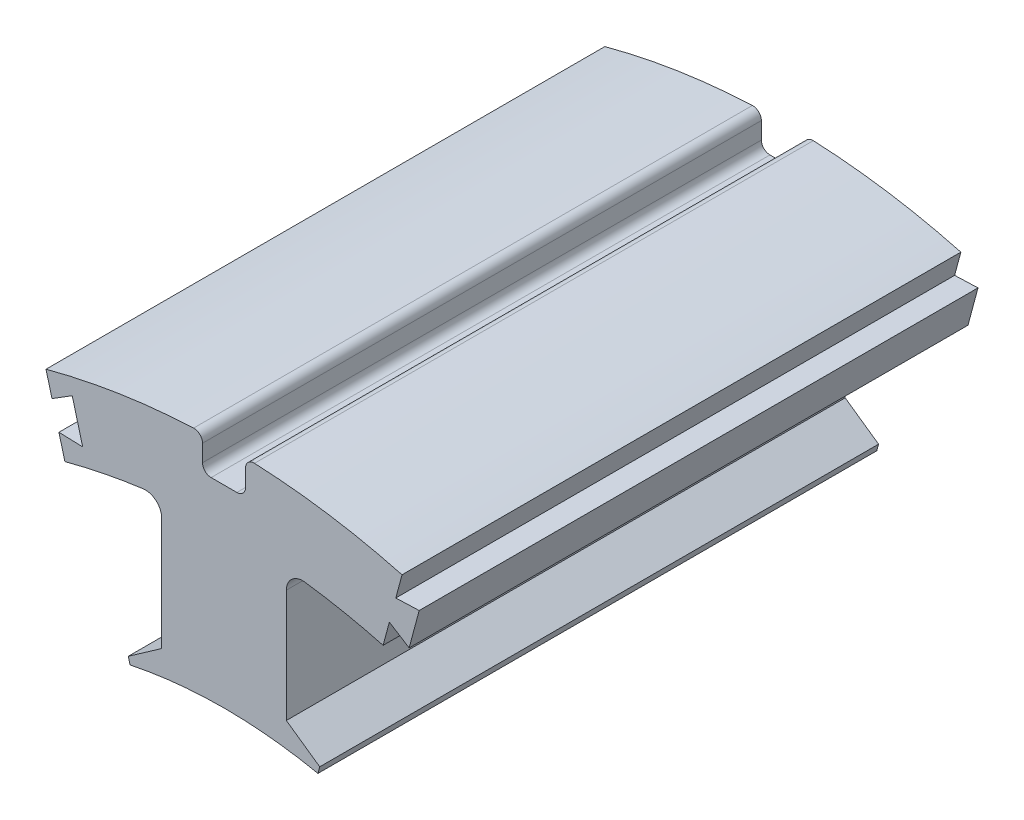
ISO-10303-21;
HEADER;
FILE_DESCRIPTION(('STEP AP214'),'2;1');
FILE_NAME('part.step','',(''),(''),'','','');
FILE_SCHEMA(('AUTOMOTIVE_DESIGN { 1 0 10303 214 1 1 1 1 }'));
ENDSEC;
DATA;
#1=APPLICATION_CONTEXT('core data for automotive mechanical design processes');
#2=APPLICATION_PROTOCOL_DEFINITION('international standard','automotive_design',2000,#1);
#3=PRODUCT_CONTEXT('',#1,'mechanical');
#4=PRODUCT('Part','Part','',(#3));
#5=PRODUCT_RELATED_PRODUCT_CATEGORY('part','',(#4));
#6=PRODUCT_DEFINITION_FORMATION('','',#4);
#7=PRODUCT_DEFINITION_CONTEXT('part definition',#1,'design');
#8=PRODUCT_DEFINITION('design','',#6,#7);
#9=PRODUCT_DEFINITION_SHAPE('','',#8);
#10=(LENGTH_UNIT() NAMED_UNIT(*) SI_UNIT(.MILLI.,.METRE.));
#11=(NAMED_UNIT(*) PLANE_ANGLE_UNIT() SI_UNIT($,.RADIAN.));
#12=(NAMED_UNIT(*) SI_UNIT($,.STERADIAN.) SOLID_ANGLE_UNIT());
#13=UNCERTAINTY_MEASURE_WITH_UNIT(LENGTH_MEASURE(1.E-05),#10,'distance_accuracy_value','');
#14=(GEOMETRIC_REPRESENTATION_CONTEXT(3) GLOBAL_UNCERTAINTY_ASSIGNED_CONTEXT((#13)) GLOBAL_UNIT_ASSIGNED_CONTEXT((#10,
#11,#12)) REPRESENTATION_CONTEXT('',''));
#15=CARTESIAN_POINT('',(0.,0.,0.));
#16=DIRECTION('',(0.,0.,1.));
#17=DIRECTION('',(1.,0.,0.));
#18=AXIS2_PLACEMENT_3D('',#15,#16,#17);
#19=CARTESIAN_POINT('',(22.699292666348,74.669284933281,-33.5));
#20=DIRECTION('',(0.0366913061718422,-0.999326647323789,0.));
#21=DIRECTION('',(0.,0.,-1.));
#22=AXIS2_PLACEMENT_3D('',#19,#20,#21);
#23=PLANE('',#22);
#24=DIRECTION('',(0.,0.,-1.));
#25=VECTOR('',#24,1.);
#26=CARTESIAN_POINT('',(19.980830281915,74.569473789516,32.5));
#27=LINE('',#26,#25);
#28=CARTESIAN_POINT('',(19.980830281915,74.569473789516,32.5));
#29=VERTEX_POINT('',#28);
#30=CARTESIAN_POINT('',(19.980830281915,74.569473789516,-32.5));
#31=VERTEX_POINT('',#30);
#32=EDGE_CURVE('E385',#29,#31,#27,.T.);
#33=ORIENTED_EDGE('',*,*,#32,.F.);
#34=DIRECTION('',(-0.999326647323789,-0.0366913061718422,0.));
#35=VECTOR('',#34,1.);
#36=CARTESIAN_POINT('',(-93.53604338755,70.401584962942,32.5));
#37=LINE('',#36,#35);
#38=CARTESIAN_POINT('',(22.699292666348,74.669284933281,32.5));
#39=VERTEX_POINT('',#38);
#40=EDGE_CURVE('E491',#39,#29,#37,.T.);
#41=ORIENTED_EDGE('',*,*,#40,.F.);
#42=DIRECTION('',(0.,0.,1.));
#43=VECTOR('',#42,1.);
#44=CARTESIAN_POINT('',(22.699292666348,74.669284933281,-32.5));
#45=LINE('',#44,#43);
#46=CARTESIAN_POINT('',(22.699292666348,74.669284933281,-32.5));
#47=VERTEX_POINT('',#46);
#48=EDGE_CURVE('E9',#47,#39,#45,.T.);
#49=ORIENTED_EDGE('',*,*,#48,.F.);
#50=DIRECTION('',(-0.999326647323789,-0.0366913061718422,0.));
#51=VECTOR('',#50,1.);
#52=CARTESIAN_POINT('',(-93.53604338755,70.401584962942,-32.5));
#53=LINE('',#52,#51);
#54=EDGE_CURVE('E482',#47,#31,#53,.T.);
#55=ORIENTED_EDGE('',*,*,#54,.T.);
#56=EDGE_LOOP('',(#33,#41,#49,#55));
#57=FACE_BOUND('',#56,.T.);
#58=ADVANCED_FACE('F15',(#57),#23,.F.);
#59=CARTESIAN_POINT('',(21.534606963387,70.32261871498,-33.5));
#60=DIRECTION('',(-0.965925826288944,0.258819045102985,0.));
#61=DIRECTION('',(0.,0.,1.));
#62=AXIS2_PLACEMENT_3D('',#59,#60,#61);
#63=PLANE('',#62);
#64=ORIENTED_EDGE('',*,*,#48,.T.);
#65=DIRECTION('',(0.258819045102985,0.965925826288944,0.));
#66=VECTOR('',#65,1.);
#67=CARTESIAN_POINT('',(-19.6757227549,-83.47642559036,32.5));
#68=LINE('',#67,#66);
#69=CARTESIAN_POINT('',(21.534606963387,70.32261871498,32.5));
#70=VERTEX_POINT('',#69);
#71=EDGE_CURVE('E536',#70,#39,#68,.T.);
#72=ORIENTED_EDGE('',*,*,#71,.F.);
#73=DIRECTION('',(0.,0.,1.));
#74=VECTOR('',#73,1.);
#75=CARTESIAN_POINT('',(21.534606963387,70.32261871498,-32.5));
#76=LINE('',#75,#74);
#77=CARTESIAN_POINT('',(21.534606963387,70.32261871498,-32.5));
#78=VERTEX_POINT('',#77);
#79=EDGE_CURVE('E25',#78,#70,#76,.T.);
#80=ORIENTED_EDGE('',*,*,#79,.F.);
#81=DIRECTION('',(0.258819045102985,0.965925826288944,0.));
#82=VECTOR('',#81,1.);
#83=CARTESIAN_POINT('',(-19.6757227549,-83.47642559036,-32.5));
#84=LINE('',#83,#82);
#85=EDGE_CURVE('E477',#78,#47,#84,.T.);
#86=ORIENTED_EDGE('',*,*,#85,.T.);
#87=EDGE_LOOP('',(#64,#72,#80,#86));
#88=FACE_BOUND('',#87,.T.);
#89=ADVANCED_FACE('F676',(#88),#63,.F.);
#90=CARTESIAN_POINT('',(19.230255051117,71.768288893278,-33.5));
#91=DIRECTION('',(0.531438926905023,0.847096610175037,0.));
#92=DIRECTION('',(0.,0.,-1.));
#93=AXIS2_PLACEMENT_3D('',#90,#91,#92);
#94=PLANE('',#93);
#95=ORIENTED_EDGE('',*,*,#79,.T.);
#96=DIRECTION('',(0.847096610175037,-0.531438926905023,0.));
#97=VECTOR('',#96,1.);
#98=CARTESIAN_POINT('',(1.745775221627,82.737442926547,32.5));
#99=LINE('',#98,#97);
#100=CARTESIAN_POINT('',(19.230255051117,71.768288893278,32.5));
#101=VERTEX_POINT('',#100);
#102=EDGE_CURVE('E535',#101,#70,#99,.T.);
#103=ORIENTED_EDGE('',*,*,#102,.F.);
#104=DIRECTION('',(0.,0.,1.));
#105=VECTOR('',#104,1.);
#106=CARTESIAN_POINT('',(19.230255051117,71.768288893278,-32.5));
#107=LINE('',#106,#105);
#108=CARTESIAN_POINT('',(19.230255051117,71.768288893278,-32.5));
#109=VERTEX_POINT('',#108);
#110=EDGE_CURVE('E519',#109,#101,#107,.T.);
#111=ORIENTED_EDGE('',*,*,#110,.F.);
#112=DIRECTION('',(0.847096610175037,-0.531438926905023,0.));
#113=VECTOR('',#112,1.);
#114=CARTESIAN_POINT('',(1.745775221627,82.737442926547,-32.5));
#115=LINE('',#114,#113);
#116=EDGE_CURVE('E478',#109,#78,#115,.T.);
#117=ORIENTED_EDGE('',*,*,#116,.T.);
#118=EDGE_LOOP('',(#95,#103,#111,#117));
#119=FACE_BOUND('',#118,.T.);
#120=ADVANCED_FACE('F17',(#119),#94,.F.);
#121=CARTESIAN_POINT('',(-7.25,55.865,-32.5));
#122=DIRECTION('',(0.573632179703012,-0.819113009547017,0.));
#123=DIRECTION('',(0.,0.,-1.));
#124=AXIS2_PLACEMENT_3D('',#121,#122,#123);
#125=PLANE('',#124);
#126=DIRECTION('',(0.,0.,-1.));
#127=VECTOR('',#126,1.);
#128=CARTESIAN_POINT('',(-11.134,53.145,32.5));
#129=LINE('',#128,#127);
#130=CARTESIAN_POINT('',(-11.134,53.145,32.5));
#131=VERTEX_POINT('',#130);
#132=CARTESIAN_POINT('',(-11.134,53.145,-32.5));
#133=VERTEX_POINT('',#132);
#134=EDGE_CURVE('E36',#131,#133,#129,.T.);
#135=ORIENTED_EDGE('',*,*,#134,.F.);
#136=DIRECTION('',(-0.819113009547017,-0.573632179703012,0.));
#137=VECTOR('',#136,1.);
#138=CARTESIAN_POINT('',(-7.25,55.865,32.5));
#139=LINE('',#138,#137);
#140=CARTESIAN_POINT('',(-7.25,55.865,32.5));
#141=VERTEX_POINT('',#140);
#142=EDGE_CURVE('E417',#141,#131,#139,.T.);
#143=ORIENTED_EDGE('',*,*,#142,.F.);
#144=DIRECTION('',(0.,0.,1.));
#145=VECTOR('',#144,1.);
#146=CARTESIAN_POINT('',(-7.25,55.865,-32.5));
#147=LINE('',#146,#145);
#148=CARTESIAN_POINT('',(-7.25,55.865,-32.5));
#149=VERTEX_POINT('',#148);
#150=EDGE_CURVE('E48',#149,#141,#147,.T.);
#151=ORIENTED_EDGE('',*,*,#150,.F.);
#152=DIRECTION('',(-0.819113009547017,-0.573632179703012,0.));
#153=VECTOR('',#152,1.);
#154=CARTESIAN_POINT('',(-7.25,55.865,-32.5));
#155=LINE('',#154,#153);
#156=EDGE_CURVE('E365',#149,#133,#155,.T.);
#157=ORIENTED_EDGE('',*,*,#156,.T.);
#158=EDGE_LOOP('',(#135,#143,#151,#157));
#159=FACE_BOUND('',#158,.T.);
#160=ADVANCED_FACE('F762',(#159),#125,.F.);
#161=CARTESIAN_POINT('',(-7.25,68.996,-32.5));
#162=DIRECTION('',(1.,0.,0.));
#163=DIRECTION('',(0.,1.,0.));
#164=AXIS2_PLACEMENT_3D('',#161,#162,#163);
#165=PLANE('',#164);
#166=ORIENTED_EDGE('',*,*,#150,.T.);
#167=DIRECTION('',(0.,-1.,0.));
#168=VECTOR('',#167,1.);
#169=CARTESIAN_POINT('',(-7.25,68.996,32.5));
#170=LINE('',#169,#168);
#171=CARTESIAN_POINT('',(-7.25,68.996,32.5));
#172=VERTEX_POINT('',#171);
#173=EDGE_CURVE('E413',#172,#141,#170,.T.);
#174=ORIENTED_EDGE('',*,*,#173,.F.);
#175=DIRECTION('',(0.,0.,1.));
#176=VECTOR('',#175,1.);
#177=CARTESIAN_POINT('',(-7.25,68.996,-32.5));
#178=LINE('',#177,#176);
#179=CARTESIAN_POINT('',(-7.25,68.996,-32.5));
#180=VERTEX_POINT('',#179);
#181=EDGE_CURVE('E458',#180,#172,#178,.T.);
#182=ORIENTED_EDGE('',*,*,#181,.F.);
#183=DIRECTION('',(0.,-1.,0.));
#184=VECTOR('',#183,1.);
#185=CARTESIAN_POINT('',(-7.25,68.996,-32.5));
#186=LINE('',#185,#184);
#187=EDGE_CURVE('E370',#180,#149,#186,.T.);
#188=ORIENTED_EDGE('',*,*,#187,.T.);
#189=EDGE_LOOP('',(#166,#174,#182,#188));
#190=FACE_BOUND('',#189,.T.);
#191=ADVANCED_FACE('F759',(#190),#165,.F.);
#192=CARTESIAN_POINT('',(-9.149889236462,68.996050217928,-32.5));
#193=DIRECTION('',(0.,0.,-1.));
#194=DIRECTION('',(-0.131526111426021,0.991312706472156,0.));
#195=AXIS2_PLACEMENT_3D('',#192,#193,#194);
#196=CYLINDRICAL_SURFACE('',#195,1.899889237125);
#197=ORIENTED_EDGE('',*,*,#181,.T.);
#198=CARTESIAN_POINT('',(-9.149889236462,68.996050217928,32.5));
#199=DIRECTION('',(0.,0.,-1.));
#200=DIRECTION('',(-0.131526111426021,0.991312706472156,0.));
#201=AXIS2_PLACEMENT_3D('',#198,#199,#200);
#202=CIRCLE('',#201,1.899889237125);
#203=CARTESIAN_POINT('',(-9.399774279961,70.87943455958,32.5));
#204=VERTEX_POINT('',#203);
#205=EDGE_CURVE('E362',#204,#172,#202,.T.);
#206=ORIENTED_EDGE('',*,*,#205,.F.);
#207=DIRECTION('',(0.,0.,1.));
#208=VECTOR('',#207,1.);
#209=CARTESIAN_POINT('',(-9.399774279961,70.87943455958,-32.5));
#210=LINE('',#209,#208);
#211=CARTESIAN_POINT('',(-9.399774279961,70.87943455958,-32.5));
#212=VERTEX_POINT('',#211);
#213=EDGE_CURVE('E454',#212,#204,#210,.T.);
#214=ORIENTED_EDGE('',*,*,#213,.F.);
#215=CARTESIAN_POINT('',(-9.149889236462,68.996050217928,-32.5));
#216=DIRECTION('',(0.,0.,-1.));
#217=DIRECTION('',(-0.131526111426021,0.991312706472156,0.));
#218=AXIS2_PLACEMENT_3D('',#215,#216,#217);
#219=CIRCLE('',#218,1.899889237125);
#220=EDGE_CURVE('E352',#212,#180,#219,.T.);
#221=ORIENTED_EDGE('',*,*,#220,.T.);
#222=EDGE_LOOP('',(#197,#206,#214,#221));
#223=FACE_BOUND('',#222,.T.);
#224=ADVANCED_FACE('F763',(#223),#196,.F.);
#225=CARTESIAN_POINT('',(4.263256414561E-13,-2.28084218179E-12,-32.5));
#226=DIRECTION('',(0.,0.,-1.));
#227=DIRECTION('',(-0.258819045102985,0.965925826288944,0.));
#228=AXIS2_PLACEMENT_3D('',#225,#226,#227);
#229=CYLINDRICAL_SURFACE('',#228,71.500000000002);
#230=ORIENTED_EDGE('',*,*,#213,.T.);
#231=CARTESIAN_POINT('',(4.263256414561E-13,-2.28084218179E-12,32.5));
#232=DIRECTION('',(0.,0.,-1.));
#233=DIRECTION('',(-0.258819045102985,0.965925826288944,0.));
#234=AXIS2_PLACEMENT_3D('',#231,#232,#233);
#235=CIRCLE('',#234,71.500000000002);
#236=CARTESIAN_POINT('',(-18.50556172483,69.063696579668,32.5));
#237=VERTEX_POINT('',#236);
#238=EDGE_CURVE('E358',#237,#204,#235,.T.);
#239=ORIENTED_EDGE('',*,*,#238,.F.);
#240=DIRECTION('',(0.,0.,1.));
#241=VECTOR('',#240,1.);
#242=CARTESIAN_POINT('',(-18.50556172483,69.063696579668,-32.5));
#243=LINE('',#242,#241);
#244=CARTESIAN_POINT('',(-18.50556172483,69.063696579668,-32.5));
#245=VERTEX_POINT('',#244);
#246=EDGE_CURVE('E457',#245,#237,#243,.T.);
#247=ORIENTED_EDGE('',*,*,#246,.F.);
#248=CARTESIAN_POINT('',(4.263256414561E-13,-2.28084218179E-12,-32.5));
#249=DIRECTION('',(0.,0.,-1.));
#250=DIRECTION('',(-0.258819045102985,0.965925826288944,0.));
#251=AXIS2_PLACEMENT_3D('',#248,#249,#250);
#252=CIRCLE('',#251,71.500000000002);
#253=EDGE_CURVE('E348',#245,#212,#252,.T.);
#254=ORIENTED_EDGE('',*,*,#253,.T.);
#255=EDGE_LOOP('',(#230,#239,#247,#254));
#256=FACE_BOUND('',#255,.T.);
#257=ADVANCED_FACE('F772',(#256),#229,.F.);
#258=CARTESIAN_POINT('',(-20.7055236082,77.274066103125,-32.5));
#259=DIRECTION('',(0.965925826288944,0.258819045102985,0.));
#260=DIRECTION('',(0.,0.,-1.));
#261=AXIS2_PLACEMENT_3D('',#258,#259,#260);
#262=PLANE('',#261);
#263=ORIENTED_EDGE('',*,*,#246,.T.);
#264=DIRECTION('',(0.258819045102985,-0.965925826288944,0.));
#265=VECTOR('',#264,1.);
#266=CARTESIAN_POINT('',(-20.7055236082,77.274066103125,32.5));
#267=LINE('',#266,#265);
#268=CARTESIAN_POINT('',(-19.2043731466,71.671696310649,32.5));
#269=VERTEX_POINT('',#268);
#270=EDGE_CURVE('E361',#269,#237,#267,.T.);
#271=ORIENTED_EDGE('',*,*,#270,.F.);
#272=DIRECTION('',(0.,0.,1.));
#273=VECTOR('',#272,1.);
#274=CARTESIAN_POINT('',(-19.2043731466,71.671696310649,-32.5));
#275=LINE('',#274,#273);
#276=CARTESIAN_POINT('',(-19.2043731466,71.671696310649,-32.5));
#277=VERTEX_POINT('',#276);
#278=EDGE_CURVE('E337',#277,#269,#275,.T.);
#279=ORIENTED_EDGE('',*,*,#278,.F.);
#280=DIRECTION('',(0.258819045102985,-0.965925826288944,0.));
#281=VECTOR('',#280,1.);
#282=CARTESIAN_POINT('',(-20.7055236082,77.274066103125,-32.5));
#283=LINE('',#282,#281);
#284=EDGE_CURVE('E355',#277,#245,#283,.T.);
#285=ORIENTED_EDGE('',*,*,#284,.T.);
#286=EDGE_LOOP('',(#263,#271,#279,#285));
#287=FACE_BOUND('',#286,.T.);
#288=ADVANCED_FACE('F955',(#287),#262,.F.);
#289=CARTESIAN_POINT('',(-19.2043731466,71.671696310649,-34.5));
#290=DIRECTION('',(0.0313823553107431,0.999507452586098,0.));
#291=DIRECTION('',(0.,0.,-1.));
#292=AXIS2_PLACEMENT_3D('',#289,#290,#291);
#293=PLANE('',#292);
#294=DIRECTION('',(0.,0.,1.));
#295=VECTOR('',#294,1.);
#296=CARTESIAN_POINT('',(-16.43761447085,71.584826119139,-32.5));
#297=LINE('',#296,#295);
#298=CARTESIAN_POINT('',(-16.43761447085,71.584826119139,-32.5));
#299=VERTEX_POINT('',#298);
#300=CARTESIAN_POINT('',(-16.43761447085,71.584826119139,32.5));
#301=VERTEX_POINT('',#300);
#302=EDGE_CURVE('E331',#299,#301,#297,.T.);
#303=ORIENTED_EDGE('',*,*,#302,.F.);
#304=DIRECTION('',(-0.999507452586098,0.0313823553107431,0.));
#305=VECTOR('',#304,1.);
#306=CARTESIAN_POINT('',(-9.555933026172,71.368756322287,-32.5));
#307=LINE('',#306,#305);
#308=EDGE_CURVE('E387',#299,#277,#307,.T.);
#309=ORIENTED_EDGE('',*,*,#308,.T.);
#310=ORIENTED_EDGE('',*,*,#278,.T.);
#311=DIRECTION('',(-0.999507452586098,0.0313823553107431,0.));
#312=VECTOR('',#311,1.);
#313=CARTESIAN_POINT('',(-9.555933026172,71.368756322287,32.5));
#314=LINE('',#313,#312);
#315=EDGE_CURVE('E396',#301,#269,#314,.T.);
#316=ORIENTED_EDGE('',*,*,#315,.F.);
#317=EDGE_LOOP('',(#303,#309,#310,#316));
#318=FACE_BOUND('',#317,.T.);
#319=ADVANCED_FACE('F742',(#318),#293,.T.);
#320=CARTESIAN_POINT('',(-16.43761447085,71.584826119139,-34.5));
#321=DIRECTION('',(-0.965925826288944,-0.258819045102985,0.));
#322=DIRECTION('',(-0.258819045102985,0.965925826288944,0.));
#323=AXIS2_PLACEMENT_3D('',#320,#321,#322);
#324=PLANE('',#323);
#325=DIRECTION('',(0.,0.,1.));
#326=VECTOR('',#325,1.);
#327=CARTESIAN_POINT('',(-17.65406398284,76.124677502698,-32.5));
#328=LINE('',#327,#326);
#329=CARTESIAN_POINT('',(-17.65406398284,76.124677502698,-32.5));
#330=VERTEX_POINT('',#329);
#331=CARTESIAN_POINT('',(-17.65406398284,76.124677502698,32.5));
#332=VERTEX_POINT('',#331);
#333=EDGE_CURVE('E19',#330,#332,#328,.T.);
#334=ORIENTED_EDGE('',*,*,#333,.F.);
#335=DIRECTION('',(0.258819045102985,-0.965925826288944,0.));
#336=VECTOR('',#335,1.);
#337=CARTESIAN_POINT('',(-15.45389626549,67.913539796407,-32.5));
#338=LINE('',#337,#336);
#339=EDGE_CURVE('E415',#330,#299,#338,.T.);
#340=ORIENTED_EDGE('',*,*,#339,.T.);
#341=ORIENTED_EDGE('',*,*,#302,.T.);
#342=DIRECTION('',(0.258819045102985,-0.965925826288944,0.));
#343=VECTOR('',#342,1.);
#344=CARTESIAN_POINT('',(-15.45389626549,67.913539796407,32.5));
#345=LINE('',#344,#343);
#346=EDGE_CURVE('E392',#332,#301,#345,.T.);
#347=ORIENTED_EDGE('',*,*,#346,.F.);
#348=EDGE_LOOP('',(#334,#340,#341,#347));
#349=FACE_BOUND('',#348,.T.);
#350=ADVANCED_FACE('F739',(#349),#324,.T.);
#351=CARTESIAN_POINT('',(-17.65406398284,76.124677502698,-34.5));
#352=DIRECTION('',(0.526931643222955,-0.849907667555927,0.));
#353=DIRECTION('',(0.,0.,-1.));
#354=AXIS2_PLACEMENT_3D('',#351,#352,#353);
#355=PLANE('',#354);
#356=DIRECTION('',(0.,0.,1.));
#357=VECTOR('',#356,1.);
#358=CARTESIAN_POINT('',(-20.00671218642,74.666066372145,-32.5));
#359=LINE('',#358,#357);
#360=CARTESIAN_POINT('',(-20.00671218642,74.666066372145,-32.5));
#361=VERTEX_POINT('',#360);
#362=CARTESIAN_POINT('',(-20.00671218642,74.666066372145,32.5));
#363=VERTEX_POINT('',#362);
#364=EDGE_CURVE('E550',#361,#363,#359,.T.);
#365=ORIENTED_EDGE('',*,*,#364,.F.);
#366=DIRECTION('',(0.849907667555927,0.526931643222955,0.));
#367=VECTOR('',#366,1.);
#368=CARTESIAN_POINT('',(-13.07044533865,78.966461141423,-32.5));
#369=LINE('',#368,#367);
#370=EDGE_CURVE('E323',#361,#330,#369,.T.);
#371=ORIENTED_EDGE('',*,*,#370,.T.);
#372=ORIENTED_EDGE('',*,*,#333,.T.);
#373=DIRECTION('',(0.849907667555927,0.526931643222955,0.));
#374=VECTOR('',#373,1.);
#375=CARTESIAN_POINT('',(-13.07044533865,78.966461141423,32.5));
#376=LINE('',#375,#374);
#377=EDGE_CURVE('E400',#363,#332,#376,.T.);
#378=ORIENTED_EDGE('',*,*,#377,.F.);
#379=EDGE_LOOP('',(#365,#371,#372,#378));
#380=FACE_BOUND('',#379,.T.);
#381=ADVANCED_FACE('F743',(#380),#355,.T.);
#382=CARTESIAN_POINT('',(-20.7055236082,77.274066103125,-32.5));
#383=DIRECTION('',(0.965925826288944,0.258819045102985,0.));
#384=DIRECTION('',(0.,0.,-1.));
#385=AXIS2_PLACEMENT_3D('',#382,#383,#384);
#386=PLANE('',#385);
#387=ORIENTED_EDGE('',*,*,#364,.T.);
#388=DIRECTION('',(0.258819045102985,-0.965925826288944,0.));
#389=VECTOR('',#388,1.);
#390=CARTESIAN_POINT('',(-20.7055236082,77.274066103125,32.5));
#391=LINE('',#390,#389);
#392=CARTESIAN_POINT('',(-20.7055236082,77.274066103126,32.5));
#393=VERTEX_POINT('',#392);
#394=EDGE_CURVE('E556',#393,#363,#391,.T.);
#395=ORIENTED_EDGE('',*,*,#394,.F.);
#396=DIRECTION('',(0.,0.,1.));
#397=VECTOR('',#396,1.);
#398=CARTESIAN_POINT('',(-20.7055236082,77.274066103126,-32.5));
#399=LINE('',#398,#397);
#400=CARTESIAN_POINT('',(-20.7055236082,77.274066103126,-32.5));
#401=VERTEX_POINT('',#400);
#402=EDGE_CURVE('E299',#401,#393,#399,.T.);
#403=ORIENTED_EDGE('',*,*,#402,.F.);
#404=DIRECTION('',(0.258819045102985,-0.965925826288944,0.));
#405=VECTOR('',#404,1.);
#406=CARTESIAN_POINT('',(-20.7055236082,77.274066103125,-32.5));
#407=LINE('',#406,#405);
#408=EDGE_CURVE('E316',#401,#361,#407,.T.);
#409=ORIENTED_EDGE('',*,*,#408,.T.);
#410=EDGE_LOOP('',(#387,#395,#403,#409));
#411=FACE_BOUND('',#410,.T.);
#412=ADVANCED_FACE('F608',(#411),#386,.F.);
#413=CARTESIAN_POINT('',(1.501021529293E-13,-5.826450433233E-13,-32.5));
#414=DIRECTION('',(0.,0.,-1.));
#415=DIRECTION('',(-0.0443040385324079,0.999018094015178,0.));
#416=AXIS2_PLACEMENT_3D('',#413,#414,#415);
#417=CYLINDRICAL_SURFACE('',#416,80.000000000001);
#418=DIRECTION('',(0.,0.,1.));
#419=VECTOR('',#418,1.);
#420=CARTESIAN_POINT('',(-3.544323082591,79.921447521214,-32.5));
#421=LINE('',#420,#419);
#422=CARTESIAN_POINT('',(-3.544323082591,79.921447521214,-32.5));
#423=VERTEX_POINT('',#422);
#424=CARTESIAN_POINT('',(-3.544323082591,79.921447521214,32.5));
#425=VERTEX_POINT('',#424);
#426=EDGE_CURVE('E288',#423,#425,#421,.T.);
#427=ORIENTED_EDGE('',*,*,#426,.F.);
#428=CARTESIAN_POINT('',(1.501021529293E-13,-5.826450433233E-13,-32.5));
#429=DIRECTION('',(0.,0.,1.));
#430=DIRECTION('',(-0.0443040385324079,0.999018094015178,0.));
#431=AXIS2_PLACEMENT_3D('',#428,#429,#430);
#432=CIRCLE('',#431,80.000000000001);
#433=EDGE_CURVE('E291',#423,#401,#432,.T.);
#434=ORIENTED_EDGE('',*,*,#433,.T.);
#435=ORIENTED_EDGE('',*,*,#402,.T.);
#436=CARTESIAN_POINT('',(1.501021529293E-13,-5.826450433233E-13,32.5));
#437=DIRECTION('',(0.,0.,1.));
#438=DIRECTION('',(-0.0443040385324079,0.999018094015178,0.));
#439=AXIS2_PLACEMENT_3D('',#436,#437,#438);
#440=CIRCLE('',#439,80.000000000001);
#441=EDGE_CURVE('E294',#425,#393,#440,.T.);
#442=ORIENTED_EDGE('',*,*,#441,.F.);
#443=EDGE_LOOP('',(#427,#434,#435,#442));
#444=FACE_BOUND('',#443,.T.);
#445=ADVANCED_FACE('F289',(#444),#417,.T.);
#446=CARTESIAN_POINT('',(-3.500696482201,78.921702424813,-32.5));
#447=DIRECTION('',(0.,0.,-1.));
#448=DIRECTION('',(0.999999955786117,0.000297368062342735,0.));
#449=AXIS2_PLACEMENT_3D('',#446,#447,#448);
#450=CYLINDRICAL_SURFACE('',#449,1.000696526446);
#451=DIRECTION('',(0.,0.,1.));
#452=VECTOR('',#451,1.);
#453=CARTESIAN_POINT('',(-2.5,78.922,-32.5));
#454=LINE('',#453,#452);
#455=CARTESIAN_POINT('',(-2.5,78.922,-32.5));
#456=VERTEX_POINT('',#455);
#457=CARTESIAN_POINT('',(-2.5,78.922,32.5));
#458=VERTEX_POINT('',#457);
#459=EDGE_CURVE('E301',#456,#458,#454,.T.);
#460=ORIENTED_EDGE('',*,*,#459,.F.);
#461=CARTESIAN_POINT('',(-3.500696482201,78.921702424813,-32.5));
#462=DIRECTION('',(0.,0.,1.));
#463=DIRECTION('',(0.999999955786117,0.000297368062342735,0.));
#464=AXIS2_PLACEMENT_3D('',#461,#462,#463);
#465=CIRCLE('',#464,1.000696526446);
#466=EDGE_CURVE('E302',#456,#423,#465,.T.);
#467=ORIENTED_EDGE('',*,*,#466,.T.);
#468=ORIENTED_EDGE('',*,*,#426,.T.);
#469=CARTESIAN_POINT('',(-3.500696482201,78.921702424813,32.5));
#470=DIRECTION('',(0.,0.,1.));
#471=DIRECTION('',(0.999999955786117,0.000297368062342735,0.));
#472=AXIS2_PLACEMENT_3D('',#469,#470,#471);
#473=CIRCLE('',#472,1.000696526446);
#474=EDGE_CURVE('E468',#458,#425,#473,.T.);
#475=ORIENTED_EDGE('',*,*,#474,.F.);
#476=EDGE_LOOP('',(#460,#467,#468,#475));
#477=FACE_BOUND('',#476,.T.);
#478=ADVANCED_FACE('F304',(#477),#450,.T.);
#479=CARTESIAN_POINT('',(-2.5,76.961,-32.5));
#480=DIRECTION('',(-1.,0.,0.));
#481=DIRECTION('',(0.,0.,1.));
#482=AXIS2_PLACEMENT_3D('',#479,#480,#481);
#483=PLANE('',#482);
#484=ORIENTED_EDGE('',*,*,#459,.T.);
#485=DIRECTION('',(0.,1.,0.));
#486=VECTOR('',#485,1.);
#487=CARTESIAN_POINT('',(-2.5,76.961,32.5));
#488=LINE('',#487,#486);
#489=CARTESIAN_POINT('',(-2.5,76.961,32.5));
#490=VERTEX_POINT('',#489);
#491=EDGE_CURVE('E463',#490,#458,#488,.T.);
#492=ORIENTED_EDGE('',*,*,#491,.F.);
#493=DIRECTION('',(0.,0.,1.));
#494=VECTOR('',#493,1.);
#495=CARTESIAN_POINT('',(-2.5,76.961,-32.5));
#496=LINE('',#495,#494);
#497=CARTESIAN_POINT('',(-2.5,76.961,-32.5));
#498=VERTEX_POINT('',#497);
#499=EDGE_CURVE('E450',#498,#490,#496,.T.);
#500=ORIENTED_EDGE('',*,*,#499,.F.);
#501=DIRECTION('',(0.,1.,0.));
#502=VECTOR('',#501,1.);
#503=CARTESIAN_POINT('',(-2.5,76.961,-32.5));
#504=LINE('',#503,#502);
#505=EDGE_CURVE('E309',#498,#456,#504,.T.);
#506=ORIENTED_EDGE('',*,*,#505,.T.);
#507=EDGE_LOOP('',(#484,#492,#500,#506));
#508=FACE_BOUND('',#507,.T.);
#509=ADVANCED_FACE('F711',(#508),#483,.F.);
#510=CARTESIAN_POINT('',(-1.5,76.961,-32.5));
#511=DIRECTION('',(0.,0.,-1.));
#512=DIRECTION('',(0.,-1.,0.));
#513=AXIS2_PLACEMENT_3D('',#510,#511,#512);
#514=CYLINDRICAL_SURFACE('',#513,1.);
#515=ORIENTED_EDGE('',*,*,#499,.T.);
#516=CARTESIAN_POINT('',(-1.5,76.961,32.5));
#517=DIRECTION('',(0.,0.,-1.));
#518=DIRECTION('',(0.,-1.,0.));
#519=AXIS2_PLACEMENT_3D('',#516,#517,#518);
#520=CIRCLE('',#519,1.);
#521=CARTESIAN_POINT('',(-1.5,75.961,32.5));
#522=VERTEX_POINT('',#521);
#523=EDGE_CURVE('E467',#522,#490,#520,.T.);
#524=ORIENTED_EDGE('',*,*,#523,.F.);
#525=DIRECTION('',(0.,0.,1.));
#526=VECTOR('',#525,1.);
#527=CARTESIAN_POINT('',(-1.5,75.961,-32.5));
#528=LINE('',#527,#526);
#529=CARTESIAN_POINT('',(-1.5,75.961,-32.5));
#530=VERTEX_POINT('',#529);
#531=EDGE_CURVE('E570',#530,#522,#528,.T.);
#532=ORIENTED_EDGE('',*,*,#531,.F.);
#533=CARTESIAN_POINT('',(-1.5,76.961,-32.5));
#534=DIRECTION('',(0.,0.,-1.));
#535=DIRECTION('',(0.,-1.,0.));
#536=AXIS2_PLACEMENT_3D('',#533,#534,#535);
#537=CIRCLE('',#536,1.);
#538=EDGE_CURVE('E433',#530,#498,#537,.T.);
#539=ORIENTED_EDGE('',*,*,#538,.T.);
#540=EDGE_LOOP('',(#515,#524,#532,#539));
#541=FACE_BOUND('',#540,.T.);
#542=ADVANCED_FACE('F708',(#541),#514,.F.);
#543=CARTESIAN_POINT('',(1.5,75.961,-32.5));
#544=DIRECTION('',(0.,-1.,0.));
#545=DIRECTION('',(0.,0.,-1.));
#546=AXIS2_PLACEMENT_3D('',#543,#544,#545);
#547=PLANE('',#546);
#548=DIRECTION('',(1.,0.,0.));
#549=VECTOR('',#548,1.);
#550=CARTESIAN_POINT('',(-1.5,75.961,-32.5));
#551=LINE('',#550,#549);
#552=CARTESIAN_POINT('',(1.5,75.961,-32.5));
#553=VERTEX_POINT('',#552);
#554=EDGE_CURVE('E436',#530,#553,#551,.T.);
#555=ORIENTED_EDGE('',*,*,#554,.F.);
#556=ORIENTED_EDGE('',*,*,#531,.T.);
#557=DIRECTION('',(-1.,0.,0.));
#558=VECTOR('',#557,1.);
#559=CARTESIAN_POINT('',(1.5,75.961,32.5));
#560=LINE('',#559,#558);
#561=CARTESIAN_POINT('',(1.5,75.961,32.5));
#562=VERTEX_POINT('',#561);
#563=EDGE_CURVE('E546',#562,#522,#560,.T.);
#564=ORIENTED_EDGE('',*,*,#563,.F.);
#565=DIRECTION('',(0.,0.,1.));
#566=VECTOR('',#565,1.);
#567=CARTESIAN_POINT('',(1.5,75.961,-32.5));
#568=LINE('',#567,#566);
#569=EDGE_CURVE('E567',#553,#562,#568,.T.);
#570=ORIENTED_EDGE('',*,*,#569,.F.);
#571=EDGE_LOOP('',(#555,#556,#564,#570));
#572=FACE_BOUND('',#571,.T.);
#573=ADVANCED_FACE('F704',(#572),#547,.F.);
#574=CARTESIAN_POINT('',(1.5,76.961,-32.5));
#575=DIRECTION('',(0.,0.,-1.));
#576=DIRECTION('',(1.,0.,0.));
#577=AXIS2_PLACEMENT_3D('',#574,#575,#576);
#578=CYLINDRICAL_SURFACE('',#577,1.);
#579=ORIENTED_EDGE('',*,*,#569,.T.);
#580=CARTESIAN_POINT('',(1.5,76.961,32.5));
#581=DIRECTION('',(0.,0.,-1.));
#582=DIRECTION('',(1.,0.,0.));
#583=AXIS2_PLACEMENT_3D('',#580,#581,#582);
#584=CIRCLE('',#583,1.);
#585=CARTESIAN_POINT('',(2.5,76.961,32.5));
#586=VERTEX_POINT('',#585);
#587=EDGE_CURVE('E422',#586,#562,#584,.T.);
#588=ORIENTED_EDGE('',*,*,#587,.F.);
#589=DIRECTION('',(0.,0.,1.));
#590=VECTOR('',#589,1.);
#591=CARTESIAN_POINT('',(2.5,76.961,-32.5));
#592=LINE('',#591,#590);
#593=CARTESIAN_POINT('',(2.5,76.961,-32.5));
#594=VERTEX_POINT('',#593);
#595=EDGE_CURVE('E600',#594,#586,#592,.T.);
#596=ORIENTED_EDGE('',*,*,#595,.F.);
#597=CARTESIAN_POINT('',(1.5,76.961,-32.5));
#598=DIRECTION('',(0.,0.,-1.));
#599=DIRECTION('',(1.,0.,0.));
#600=AXIS2_PLACEMENT_3D('',#597,#598,#599);
#601=CIRCLE('',#600,1.);
#602=EDGE_CURVE('E444',#594,#553,#601,.T.);
#603=ORIENTED_EDGE('',*,*,#602,.T.);
#604=EDGE_LOOP('',(#579,#588,#596,#603));
#605=FACE_BOUND('',#604,.T.);
#606=ADVANCED_FACE('F697',(#605),#578,.F.);
#607=CARTESIAN_POINT('',(2.5,78.922,-32.5));
#608=DIRECTION('',(1.,0.,0.));
#609=DIRECTION('',(0.,1.,0.));
#610=AXIS2_PLACEMENT_3D('',#607,#608,#609);
#611=PLANE('',#610);
#612=ORIENTED_EDGE('',*,*,#595,.T.);
#613=DIRECTION('',(0.,-1.,0.));
#614=VECTOR('',#613,1.);
#615=CARTESIAN_POINT('',(2.5,78.922,32.5));
#616=LINE('',#615,#614);
#617=CARTESIAN_POINT('',(2.5,78.922,32.5));
#618=VERTEX_POINT('',#617);
#619=EDGE_CURVE('E423',#618,#586,#616,.T.);
#620=ORIENTED_EDGE('',*,*,#619,.F.);
#621=DIRECTION('',(0.,0.,1.));
#622=VECTOR('',#621,1.);
#623=CARTESIAN_POINT('',(2.5,78.922,-32.5));
#624=LINE('',#623,#622);
#625=CARTESIAN_POINT('',(2.5,78.922,-32.5));
#626=VERTEX_POINT('',#625);
#627=EDGE_CURVE('E381',#626,#618,#624,.T.);
#628=ORIENTED_EDGE('',*,*,#627,.F.);
#629=DIRECTION('',(0.,-1.,0.));
#630=VECTOR('',#629,1.);
#631=CARTESIAN_POINT('',(2.5,78.922,-32.5));
#632=LINE('',#631,#630);
#633=EDGE_CURVE('E447',#626,#594,#632,.T.);
#634=ORIENTED_EDGE('',*,*,#633,.T.);
#635=EDGE_LOOP('',(#612,#620,#628,#634));
#636=FACE_BOUND('',#635,.T.);
#637=ADVANCED_FACE('F698',(#636),#611,.F.);
#638=CARTESIAN_POINT('',(3.500696482201,78.921702424813,-32.5));
#639=DIRECTION('',(0.,0.,-1.));
#640=DIRECTION('',(0.0435962344599089,0.999049232190745,0.));
#641=AXIS2_PLACEMENT_3D('',#638,#639,#640);
#642=CYLINDRICAL_SURFACE('',#641,1.000696526446);
#643=DIRECTION('',(0.,0.,1.));
#644=VECTOR('',#643,1.);
#645=CARTESIAN_POINT('',(3.544323082591,79.921447521214,-32.5));
#646=LINE('',#645,#644);
#647=CARTESIAN_POINT('',(3.544323082591,79.921447521214,-32.5));
#648=VERTEX_POINT('',#647);
#649=CARTESIAN_POINT('',(3.544323082591,79.921447521214,32.5));
#650=VERTEX_POINT('',#649);
#651=EDGE_CURVE('E378',#648,#650,#646,.T.);
#652=ORIENTED_EDGE('',*,*,#651,.F.);
#653=CARTESIAN_POINT('',(3.500696482201,78.921702424813,-32.5));
#654=DIRECTION('',(0.,0.,1.));
#655=DIRECTION('',(0.0435962344599089,0.999049232190745,0.));
#656=AXIS2_PLACEMENT_3D('',#653,#654,#655);
#657=CIRCLE('',#656,1.000696526446);
#658=EDGE_CURVE('E452',#648,#626,#657,.T.);
#659=ORIENTED_EDGE('',*,*,#658,.T.);
#660=ORIENTED_EDGE('',*,*,#627,.T.);
#661=CARTESIAN_POINT('',(3.500696482201,78.921702424813,32.5));
#662=DIRECTION('',(0.,0.,1.));
#663=DIRECTION('',(0.0435962344599089,0.999049232190745,0.));
#664=AXIS2_PLACEMENT_3D('',#661,#662,#663);
#665=CIRCLE('',#664,1.000696526446);
#666=EDGE_CURVE('E373',#650,#618,#665,.T.);
#667=ORIENTED_EDGE('',*,*,#666,.F.);
#668=EDGE_LOOP('',(#652,#659,#660,#667));
#669=FACE_BOUND('',#668,.T.);
#670=ADVANCED_FACE('F692',(#669),#642,.T.);
#671=CARTESIAN_POINT('',(-6.119549311734E-13,-3.574029960873E-12,-32.5));
#672=DIRECTION('',(0.,0.,-1.));
#673=DIRECTION('',(0.258819045102985,0.965925826288944,0.));
#674=AXIS2_PLACEMENT_3D('',#671,#672,#673);
#675=CYLINDRICAL_SURFACE('',#674,80.000000000004);
#676=DIRECTION('',(0.,0.,1.));
#677=VECTOR('',#676,1.);
#678=CARTESIAN_POINT('',(20.705523608202,77.274066103126,-32.5));
#679=LINE('',#678,#677);
#680=CARTESIAN_POINT('',(20.705523608202,77.274066103126,-32.5));
#681=VERTEX_POINT('',#680);
#682=CARTESIAN_POINT('',(20.705523608202,77.274066103126,32.5));
#683=VERTEX_POINT('',#682);
#684=EDGE_CURVE('E588',#681,#683,#679,.T.);
#685=ORIENTED_EDGE('',*,*,#684,.F.);
#686=CARTESIAN_POINT('',(-6.119549311734E-13,-3.574029960873E-12,-32.5));
#687=DIRECTION('',(0.,0.,1.));
#688=DIRECTION('',(0.258819045102985,0.965925826288944,0.));
#689=AXIS2_PLACEMENT_3D('',#686,#687,#688);
#690=CIRCLE('',#689,80.000000000004);
#691=EDGE_CURVE('E462',#681,#648,#690,.T.);
#692=ORIENTED_EDGE('',*,*,#691,.T.);
#693=ORIENTED_EDGE('',*,*,#651,.T.);
#694=CARTESIAN_POINT('',(-6.119549311734E-13,-3.574029960873E-12,32.5));
#695=DIRECTION('',(0.,0.,1.));
#696=DIRECTION('',(0.258819045102985,0.965925826288944,0.));
#697=AXIS2_PLACEMENT_3D('',#694,#695,#696);
#698=CIRCLE('',#697,80.000000000004);
#699=EDGE_CURVE('E369',#683,#650,#698,.T.);
#700=ORIENTED_EDGE('',*,*,#699,.F.);
#701=EDGE_LOOP('',(#685,#692,#693,#700));
#702=FACE_BOUND('',#701,.T.);
#703=ADVANCED_FACE('F688',(#702),#675,.T.);
#704=CARTESIAN_POINT('',(18.50556172483,69.063696579668,-32.5));
#705=DIRECTION('',(-0.965925826288944,0.258819045102985,0.));
#706=DIRECTION('',(0.,0.,1.));
#707=AXIS2_PLACEMENT_3D('',#704,#705,#706);
#708=PLANE('',#707);
#709=ORIENTED_EDGE('',*,*,#684,.T.);
#710=DIRECTION('',(0.258819045102985,0.965925826288944,0.));
#711=VECTOR('',#710,1.);
#712=CARTESIAN_POINT('',(18.50556172483,69.063696579668,32.5));
#713=LINE('',#712,#711);
#714=EDGE_CURVE('E372',#29,#683,#713,.T.);
#715=ORIENTED_EDGE('',*,*,#714,.F.);
#716=ORIENTED_EDGE('',*,*,#32,.T.);
#717=DIRECTION('',(0.258819045102985,0.965925826288944,0.));
#718=VECTOR('',#717,1.);
#719=CARTESIAN_POINT('',(18.50556172483,69.063696579668,-32.5));
#720=LINE('',#719,#718);
#721=EDGE_CURVE('E471',#31,#681,#720,.T.);
#722=ORIENTED_EDGE('',*,*,#721,.T.);
#723=EDGE_LOOP('',(#709,#715,#716,#722));
#724=FACE_BOUND('',#723,.T.);
#725=ADVANCED_FACE('F683',(#724),#708,.F.);
#726=CARTESIAN_POINT('',(18.50556172483,69.063696579668,-32.5));
#727=DIRECTION('',(-0.965925826288944,0.258819045102985,0.));
#728=DIRECTION('',(0.,0.,1.));
#729=AXIS2_PLACEMENT_3D('',#726,#727,#728);
#730=PLANE('',#729);
#731=ORIENTED_EDGE('',*,*,#110,.T.);
#732=DIRECTION('',(0.258819045102985,0.965925826288944,0.));
#733=VECTOR('',#732,1.);
#734=CARTESIAN_POINT('',(18.50556172483,69.063696579668,32.5));
#735=LINE('',#734,#733);
#736=CARTESIAN_POINT('',(18.50556172483,69.063696579668,32.5));
#737=VERTEX_POINT('',#736);
#738=EDGE_CURVE('E504',#737,#101,#735,.T.);
#739=ORIENTED_EDGE('',*,*,#738,.F.);
#740=DIRECTION('',(0.,0.,1.));
#741=VECTOR('',#740,1.);
#742=CARTESIAN_POINT('',(18.50556172483,69.063696579668,-32.5));
#743=LINE('',#742,#741);
#744=CARTESIAN_POINT('',(18.50556172483,69.063696579668,-32.5));
#745=VERTEX_POINT('',#744);
#746=EDGE_CURVE('E520',#745,#737,#743,.T.);
#747=ORIENTED_EDGE('',*,*,#746,.F.);
#748=DIRECTION('',(0.258819045102985,0.965925826288944,0.));
#749=VECTOR('',#748,1.);
#750=CARTESIAN_POINT('',(18.50556172483,69.063696579668,-32.5));
#751=LINE('',#750,#749);
#752=EDGE_CURVE('E404',#745,#109,#751,.T.);
#753=ORIENTED_EDGE('',*,*,#752,.T.);
#754=EDGE_LOOP('',(#731,#739,#747,#753));
#755=FACE_BOUND('',#754,.T.);
#756=ADVANCED_FACE('F670',(#755),#730,.F.);
#757=CARTESIAN_POINT('',(-1.163513729807E-12,-5.975664407742E-12,-32.5));
#758=DIRECTION('',(0.,0.,-1.));
#759=DIRECTION('',(0.131465374545005,0.991320763071036,0.));
#760=AXIS2_PLACEMENT_3D('',#757,#758,#759);
#761=CYLINDRICAL_SURFACE('',#760,71.500000000006);
#762=ORIENTED_EDGE('',*,*,#746,.T.);
#763=CARTESIAN_POINT('',(-1.163513729807E-12,-5.975664407742E-12,32.5));
#764=DIRECTION('',(0.,0.,-1.));
#765=DIRECTION('',(0.131465374545005,0.991320763071036,0.));
#766=AXIS2_PLACEMENT_3D('',#763,#764,#765);
#767=CIRCLE('',#766,71.500000000006);
#768=CARTESIAN_POINT('',(9.399774279961,70.87943455958,32.5));
#769=VERTEX_POINT('',#768);
#770=EDGE_CURVE('E496',#769,#737,#767,.T.);
#771=ORIENTED_EDGE('',*,*,#770,.F.);
#772=DIRECTION('',(0.,0.,1.));
#773=VECTOR('',#772,1.);
#774=CARTESIAN_POINT('',(9.399774279961,70.87943455958,-32.5));
#775=LINE('',#774,#773);
#776=CARTESIAN_POINT('',(9.399774279961,70.87943455958,-32.5));
#777=VERTEX_POINT('',#776);
#778=EDGE_CURVE('E341',#777,#769,#775,.T.);
#779=ORIENTED_EDGE('',*,*,#778,.F.);
#780=CARTESIAN_POINT('',(-1.163513729807E-12,-5.975664407742E-12,-32.5));
#781=DIRECTION('',(0.,0.,-1.));
#782=DIRECTION('',(0.131465374545005,0.991320763071036,0.));
#783=AXIS2_PLACEMENT_3D('',#780,#781,#782);
#784=CIRCLE('',#783,71.500000000006);
#785=EDGE_CURVE('E346',#777,#745,#784,.T.);
#786=ORIENTED_EDGE('',*,*,#785,.T.);
#787=EDGE_LOOP('',(#762,#771,#779,#786));
#788=FACE_BOUND('',#787,.T.);
#789=ADVANCED_FACE('F666',(#788),#761,.F.);
#790=CARTESIAN_POINT('',(9.149889236462,68.996050217928,-32.5));
#791=DIRECTION('',(0.,0.,-1.));
#792=DIRECTION('',(-0.999999999650674,-2.64320293124814E-05,0.));
#793=AXIS2_PLACEMENT_3D('',#790,#791,#792);
#794=CYLINDRICAL_SURFACE('',#793,1.899889237125);
#795=ORIENTED_EDGE('',*,*,#778,.T.);
#796=CARTESIAN_POINT('',(9.149889236462,68.996050217928,32.5));
#797=DIRECTION('',(0.,0.,-1.));
#798=DIRECTION('',(-0.999999999650674,-2.64320293124814E-05,0.));
#799=AXIS2_PLACEMENT_3D('',#796,#797,#798);
#800=CIRCLE('',#799,1.899889237125);
#801=CARTESIAN_POINT('',(7.25,68.996,32.5));
#802=VERTEX_POINT('',#801);
#803=EDGE_CURVE('E503',#802,#769,#800,.T.);
#804=ORIENTED_EDGE('',*,*,#803,.F.);
#805=DIRECTION('',(0.,0.,1.));
#806=VECTOR('',#805,1.);
#807=CARTESIAN_POINT('',(7.25,68.996,-32.5));
#808=LINE('',#807,#806);
#809=CARTESIAN_POINT('',(7.25,68.996,-32.5));
#810=VERTEX_POINT('',#809);
#811=EDGE_CURVE('E339',#810,#802,#808,.T.);
#812=ORIENTED_EDGE('',*,*,#811,.F.);
#813=CARTESIAN_POINT('',(9.149889236462,68.996050217928,-32.5));
#814=DIRECTION('',(0.,0.,-1.));
#815=DIRECTION('',(-0.999999999650674,-2.64320293124814E-05,0.));
#816=AXIS2_PLACEMENT_3D('',#813,#814,#815);
#817=CIRCLE('',#816,1.899889237125);
#818=EDGE_CURVE('E345',#810,#777,#817,.T.);
#819=ORIENTED_EDGE('',*,*,#818,.T.);
#820=EDGE_LOOP('',(#795,#804,#812,#819));
#821=FACE_BOUND('',#820,.T.);
#822=ADVANCED_FACE('F665',(#821),#794,.F.);
#823=CARTESIAN_POINT('',(7.25,55.865,-32.5));
#824=DIRECTION('',(-1.,0.,0.));
#825=DIRECTION('',(0.,0.,1.));
#826=AXIS2_PLACEMENT_3D('',#823,#824,#825);
#827=PLANE('',#826);
#828=ORIENTED_EDGE('',*,*,#811,.T.);
#829=DIRECTION('',(0.,1.,0.));
#830=VECTOR('',#829,1.);
#831=CARTESIAN_POINT('',(7.25,55.865,32.5));
#832=LINE('',#831,#830);
#833=CARTESIAN_POINT('',(7.25,55.865,32.5));
#834=VERTEX_POINT('',#833);
#835=EDGE_CURVE('E516',#834,#802,#832,.T.);
#836=ORIENTED_EDGE('',*,*,#835,.F.);
#837=DIRECTION('',(0.,0.,1.));
#838=VECTOR('',#837,1.);
#839=CARTESIAN_POINT('',(7.25,55.865,-32.5));
#840=LINE('',#839,#838);
#841=CARTESIAN_POINT('',(7.25,55.865,-32.5));
#842=VERTEX_POINT('',#841);
#843=EDGE_CURVE('E511',#842,#834,#840,.T.);
#844=ORIENTED_EDGE('',*,*,#843,.F.);
#845=DIRECTION('',(0.,1.,0.));
#846=VECTOR('',#845,1.);
#847=CARTESIAN_POINT('',(7.25,55.865,-32.5));
#848=LINE('',#847,#846);
#849=EDGE_CURVE('E350',#842,#810,#848,.T.);
#850=ORIENTED_EDGE('',*,*,#849,.T.);
#851=EDGE_LOOP('',(#828,#836,#844,#850));
#852=FACE_BOUND('',#851,.T.);
#853=ADVANCED_FACE('F658',(#852),#827,.F.);
#854=CARTESIAN_POINT('',(-11.134,53.145,-30.5));
#855=DIRECTION('',(0.965964780633967,0.258673621721991,0.));
#856=DIRECTION('',(0.,0.,-1.));
#857=AXIS2_PLACEMENT_3D('',#854,#855,#856);
#858=PLANE('',#857);
#859=DIRECTION('',(0.,0.,-1.));
#860=VECTOR('',#859,1.);
#861=CARTESIAN_POINT('',(-10.927,52.372,32.5));
#862=LINE('',#861,#860);
#863=CARTESIAN_POINT('',(-10.927,52.372,32.5));
#864=VERTEX_POINT('',#863);
#865=CARTESIAN_POINT('',(-10.927,52.372,-32.5));
#866=VERTEX_POINT('',#865);
#867=EDGE_CURVE('E390',#864,#866,#862,.T.);
#868=ORIENTED_EDGE('',*,*,#867,.F.);
#869=DIRECTION('',(0.258673621721991,-0.965964780633967,0.));
#870=VECTOR('',#869,1.);
#871=CARTESIAN_POINT('',(-11.134,53.145,32.5));
#872=LINE('',#871,#870);
#873=EDGE_CURVE('E431',#131,#864,#872,.T.);
#874=ORIENTED_EDGE('',*,*,#873,.F.);
#875=ORIENTED_EDGE('',*,*,#134,.T.);
#876=DIRECTION('',(0.258673621721991,-0.965964780633967,0.));
#877=VECTOR('',#876,1.);
#878=CARTESIAN_POINT('',(-11.134,53.145,-32.5));
#879=LINE('',#878,#877);
#880=EDGE_CURVE('E366',#133,#866,#879,.T.);
#881=ORIENTED_EDGE('',*,*,#880,.T.);
#882=EDGE_LOOP('',(#868,#874,#875,#881));
#883=FACE_BOUND('',#882,.T.);
#884=ADVANCED_FACE('F746',(#883),#858,.F.);
#885=CARTESIAN_POINT('',(0.,68.119525999224,32.5));
#886=DIRECTION('',(0.,0.,1.));
#887=DIRECTION('',(1.,0.,0.));
#888=AXIS2_PLACEMENT_3D('',#885,#886,#887);
#889=PLANE('',#888);
#890=CARTESIAN_POINT('',(-0.001105013896021,0.02146984649098,32.5));
#891=DIRECTION('',(0.,0.,-1.));
#892=DIRECTION('',(-0.204304324602912,0.978907423073575,0.));
#893=AXIS2_PLACEMENT_3D('',#890,#891,#892);
#894=CIRCLE('',#893,53.478530164925);
#895=CARTESIAN_POINT('',(0.,53.5,32.5));
#896=VERTEX_POINT('',#895);
#897=EDGE_CURVE('E330',#864,#896,#894,.T.);
#898=ORIENTED_EDGE('',*,*,#897,.T.);
#899=CARTESIAN_POINT('',(0.001105013896021,0.02146984649098,32.5));
#900=DIRECTION('',(0.,0.,-1.));
#901=DIRECTION('',(-2.06627574208202E-05,0.999999999786525,0.));
#902=AXIS2_PLACEMENT_3D('',#899,#900,#901);
#903=CIRCLE('',#902,53.478530164925);
#904=CARTESIAN_POINT('',(10.927,52.372,32.5));
#905=VERTEX_POINT('',#904);
#906=EDGE_CURVE('E622',#896,#905,#903,.T.);
#907=ORIENTED_EDGE('',*,*,#906,.T.);
#908=DIRECTION('',(0.258673621721991,0.965964780633967,0.));
#909=VECTOR('',#908,1.);
#910=CARTESIAN_POINT('',(10.927,52.372,32.5));
#911=LINE('',#910,#909);
#912=CARTESIAN_POINT('',(11.134,53.145,32.5));
#913=VERTEX_POINT('',#912);
#914=EDGE_CURVE('E328',#905,#913,#911,.T.);
#915=ORIENTED_EDGE('',*,*,#914,.T.);
#916=DIRECTION('',(-0.819113009547017,0.573632179703012,0.));
#917=VECTOR('',#916,1.);
#918=CARTESIAN_POINT('',(11.134,53.145,32.5));
#919=LINE('',#918,#917);
#920=EDGE_CURVE('E508',#913,#834,#919,.T.);
#921=ORIENTED_EDGE('',*,*,#920,.T.);
#922=ORIENTED_EDGE('',*,*,#835,.T.);
#923=ORIENTED_EDGE('',*,*,#803,.T.);
#924=ORIENTED_EDGE('',*,*,#770,.T.);
#925=ORIENTED_EDGE('',*,*,#738,.T.);
#926=ORIENTED_EDGE('',*,*,#102,.T.);
#927=ORIENTED_EDGE('',*,*,#71,.T.);
#928=ORIENTED_EDGE('',*,*,#40,.T.);
#929=ORIENTED_EDGE('',*,*,#714,.T.);
#930=ORIENTED_EDGE('',*,*,#699,.T.);
#931=ORIENTED_EDGE('',*,*,#666,.T.);
#932=ORIENTED_EDGE('',*,*,#619,.T.);
#933=ORIENTED_EDGE('',*,*,#587,.T.);
#934=ORIENTED_EDGE('',*,*,#563,.T.);
#935=ORIENTED_EDGE('',*,*,#523,.T.);
#936=ORIENTED_EDGE('',*,*,#491,.T.);
#937=ORIENTED_EDGE('',*,*,#474,.T.);
#938=ORIENTED_EDGE('',*,*,#441,.T.);
#939=ORIENTED_EDGE('',*,*,#394,.T.);
#940=ORIENTED_EDGE('',*,*,#377,.T.);
#941=ORIENTED_EDGE('',*,*,#346,.T.);
#942=ORIENTED_EDGE('',*,*,#315,.T.);
#943=ORIENTED_EDGE('',*,*,#270,.T.);
#944=ORIENTED_EDGE('',*,*,#238,.T.);
#945=ORIENTED_EDGE('',*,*,#205,.T.);
#946=ORIENTED_EDGE('',*,*,#173,.T.);
#947=ORIENTED_EDGE('',*,*,#142,.T.);
#948=ORIENTED_EDGE('',*,*,#873,.T.);
#949=EDGE_LOOP('',(#898,#907,#915,#921,#922,#923,#924,#925,#926,#927,#928,#929,#930,#931,#932,
#933,#934,#935,#936,#937,#938,#939,#940,#941,#942,#943,#944,#945,#946,#947,#948));
#950=FACE_BOUND('',#949,.T.);
#951=ADVANCED_FACE('F614',(#950),#889,.T.);
#952=CARTESIAN_POINT('',(11.134,53.145,-30.5));
#953=DIRECTION('',(-0.573632179703012,-0.819113009547017,0.));
#954=DIRECTION('',(-0.819113009547017,0.573632179703012,0.));
#955=AXIS2_PLACEMENT_3D('',#952,#953,#954);
#956=PLANE('',#955);
#957=ORIENTED_EDGE('',*,*,#920,.F.);
#958=DIRECTION('',(0.,0.,1.));
#959=VECTOR('',#958,1.);
#960=CARTESIAN_POINT('',(11.134,53.145,-32.5));
#961=LINE('',#960,#959);
#962=CARTESIAN_POINT('',(11.134,53.145,-32.5));
#963=VERTEX_POINT('',#962);
#964=EDGE_CURVE('E360',#963,#913,#961,.T.);
#965=ORIENTED_EDGE('',*,*,#964,.F.);
#966=DIRECTION('',(-0.819113009547017,0.573632179703012,0.));
#967=VECTOR('',#966,1.);
#968=CARTESIAN_POINT('',(11.134,53.145,-32.5));
#969=LINE('',#968,#967);
#970=EDGE_CURVE('E499',#963,#842,#969,.T.);
#971=ORIENTED_EDGE('',*,*,#970,.T.);
#972=ORIENTED_EDGE('',*,*,#843,.T.);
#973=EDGE_LOOP('',(#957,#965,#971,#972));
#974=FACE_BOUND('',#973,.T.);
#975=ADVANCED_FACE('F656',(#974),#956,.F.);
#976=CARTESIAN_POINT('',(0.,68.119525999224,-32.5));
#977=DIRECTION('',(0.,0.,1.));
#978=DIRECTION('',(1.,0.,0.));
#979=AXIS2_PLACEMENT_3D('',#976,#977,#978);
#980=PLANE('',#979);
#981=ORIENTED_EDGE('',*,*,#880,.F.);
#982=ORIENTED_EDGE('',*,*,#156,.F.);
#983=ORIENTED_EDGE('',*,*,#187,.F.);
#984=ORIENTED_EDGE('',*,*,#220,.F.);
#985=ORIENTED_EDGE('',*,*,#253,.F.);
#986=ORIENTED_EDGE('',*,*,#284,.F.);
#987=ORIENTED_EDGE('',*,*,#308,.F.);
#988=ORIENTED_EDGE('',*,*,#339,.F.);
#989=ORIENTED_EDGE('',*,*,#370,.F.);
#990=ORIENTED_EDGE('',*,*,#408,.F.);
#991=ORIENTED_EDGE('',*,*,#433,.F.);
#992=ORIENTED_EDGE('',*,*,#466,.F.);
#993=ORIENTED_EDGE('',*,*,#505,.F.);
#994=ORIENTED_EDGE('',*,*,#538,.F.);
#995=ORIENTED_EDGE('',*,*,#554,.T.);
#996=ORIENTED_EDGE('',*,*,#602,.F.);
#997=ORIENTED_EDGE('',*,*,#633,.F.);
#998=ORIENTED_EDGE('',*,*,#658,.F.);
#999=ORIENTED_EDGE('',*,*,#691,.F.);
#1000=ORIENTED_EDGE('',*,*,#721,.F.);
#1001=ORIENTED_EDGE('',*,*,#54,.F.);
#1002=ORIENTED_EDGE('',*,*,#85,.F.);
#1003=ORIENTED_EDGE('',*,*,#116,.F.);
#1004=ORIENTED_EDGE('',*,*,#752,.F.);
#1005=ORIENTED_EDGE('',*,*,#785,.F.);
#1006=ORIENTED_EDGE('',*,*,#818,.F.);
#1007=ORIENTED_EDGE('',*,*,#849,.F.);
#1008=ORIENTED_EDGE('',*,*,#970,.F.);
#1009=DIRECTION('',(0.258673621721991,0.965964780633967,0.));
#1010=VECTOR('',#1009,1.);
#1011=CARTESIAN_POINT('',(10.927,52.372,-32.5));
#1012=LINE('',#1011,#1010);
#1013=CARTESIAN_POINT('',(10.927,52.372,-32.5));
#1014=VERTEX_POINT('',#1013);
#1015=EDGE_CURVE('E335',#1014,#963,#1012,.T.);
#1016=ORIENTED_EDGE('',*,*,#1015,.F.);
#1017=CARTESIAN_POINT('',(0.001105013896021,0.02146984649098,-32.5));
#1018=DIRECTION('',(0.,0.,-1.));
#1019=DIRECTION('',(-2.06627574208202E-05,0.999999999786525,0.));
#1020=AXIS2_PLACEMENT_3D('',#1017,#1018,#1019);
#1021=CIRCLE('',#1020,53.478530164925);
#1022=CARTESIAN_POINT('',(0.,53.5,-32.5));
#1023=VERTEX_POINT('',#1022);
#1024=EDGE_CURVE('E635',#1023,#1014,#1021,.T.);
#1025=ORIENTED_EDGE('',*,*,#1024,.F.);
#1026=CARTESIAN_POINT('',(-0.001105013896021,0.02146984649098,-32.5));
#1027=DIRECTION('',(0.,0.,-1.));
#1028=DIRECTION('',(-0.204304324602912,0.978907423073575,0.));
#1029=AXIS2_PLACEMENT_3D('',#1026,#1027,#1028);
#1030=CIRCLE('',#1029,53.478530164925);
#1031=EDGE_CURVE('E391',#866,#1023,#1030,.T.);
#1032=ORIENTED_EDGE('',*,*,#1031,.F.);
#1033=EDGE_LOOP('',(#981,#982,#983,#984,#985,#986,#987,#988,#989,#990,#991,#992,#993,#994,#995,
#996,#997,#998,#999,#1000,#1001,#1002,#1003,#1004,#1005,#1006,#1007,#1008,#1016,#1025,#1032));
#1034=FACE_BOUND('',#1033,.T.);
#1035=ADVANCED_FACE('F311',(#1034),#980,.F.);
#1036=CARTESIAN_POINT('',(-0.001105013896021,0.02146984649098,-30.5));
#1037=DIRECTION('',(0.,0.,-1.));
#1038=DIRECTION('',(-0.204304324602912,0.978907423073575,0.));
#1039=AXIS2_PLACEMENT_3D('',#1036,#1037,#1038);
#1040=CYLINDRICAL_SURFACE('',#1039,53.478530164925);
#1041=DIRECTION('',(0.,0.,-1.));
#1042=VECTOR('',#1041,1.);
#1043=CARTESIAN_POINT('',(0.,53.5,32.5));
#1044=LINE('',#1043,#1042);
#1045=EDGE_CURVE('E627',#896,#1023,#1044,.T.);
#1046=ORIENTED_EDGE('',*,*,#1045,.F.);
#1047=ORIENTED_EDGE('',*,*,#897,.F.);
#1048=ORIENTED_EDGE('',*,*,#867,.T.);
#1049=ORIENTED_EDGE('',*,*,#1031,.T.);
#1050=EDGE_LOOP('',(#1046,#1047,#1048,#1049));
#1051=FACE_BOUND('',#1050,.T.);
#1052=ADVANCED_FACE('F649',(#1051),#1040,.F.);
#1053=CARTESIAN_POINT('',(10.927,52.372,-30.5));
#1054=DIRECTION('',(-0.965964780633967,0.258673621721991,0.));
#1055=DIRECTION('',(0.,0.,1.));
#1056=AXIS2_PLACEMENT_3D('',#1053,#1054,#1055);
#1057=PLANE('',#1056);
#1058=ORIENTED_EDGE('',*,*,#914,.F.);
#1059=DIRECTION('',(0.,0.,1.));
#1060=VECTOR('',#1059,1.);
#1061=CARTESIAN_POINT('',(10.927,52.372,-32.5));
#1062=LINE('',#1061,#1060);
#1063=EDGE_CURVE('E334',#1014,#905,#1062,.T.);
#1064=ORIENTED_EDGE('',*,*,#1063,.F.);
#1065=ORIENTED_EDGE('',*,*,#1015,.T.);
#1066=ORIENTED_EDGE('',*,*,#964,.T.);
#1067=EDGE_LOOP('',(#1058,#1064,#1065,#1066));
#1068=FACE_BOUND('',#1067,.T.);
#1069=ADVANCED_FACE('F652',(#1068),#1057,.F.);
#1070=CARTESIAN_POINT('',(0.001105013896021,0.02146984649098,-30.5));
#1071=DIRECTION('',(0.,0.,-1.));
#1072=DIRECTION('',(-2.06627574208202E-05,0.999999999786525,0.));
#1073=AXIS2_PLACEMENT_3D('',#1070,#1071,#1072);
#1074=CYLINDRICAL_SURFACE('',#1073,53.478530164925);
#1075=ORIENTED_EDGE('',*,*,#906,.F.);
#1076=ORIENTED_EDGE('',*,*,#1045,.T.);
#1077=ORIENTED_EDGE('',*,*,#1024,.T.);
#1078=ORIENTED_EDGE('',*,*,#1063,.T.);
#1079=EDGE_LOOP('',(#1075,#1076,#1077,#1078));
#1080=FACE_BOUND('',#1079,.T.);
#1081=ADVANCED_FACE('F641',(#1080),#1074,.F.);
#1082=CLOSED_SHELL('',(#58,#89,#120,#160,#191,#224,#257,#288,#319,#350,#381,#412,#445,#478,#509,
#542,#573,#606,#637,#670,#703,#725,#756,#789,#822,#853,#884,#951,#975,#1035,#1052,#1069,#1081));
#1083=MANIFOLD_SOLID_BREP('B1',#1082);
#1084=ADVANCED_BREP_SHAPE_REPRESENTATION('',(#18,#1083),#14);
#1085=SHAPE_DEFINITION_REPRESENTATION(#9,#1084);
ENDSEC;
END-ISO-10303-21;
